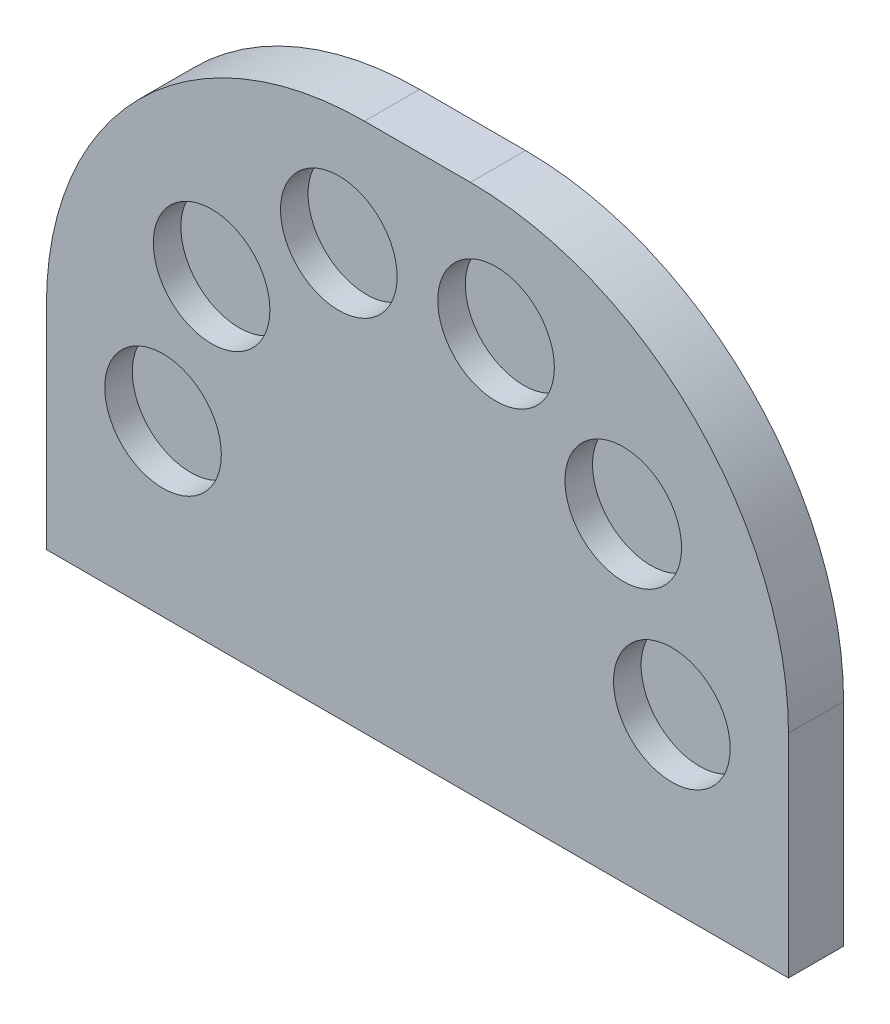
ISO-10303-21;
HEADER;
FILE_DESCRIPTION(('STEP AP214'),'2;1');
FILE_NAME('part.step','',(''),(''),'','','');
FILE_SCHEMA(('AUTOMOTIVE_DESIGN { 1 0 10303 214 1 1 1 1 }'));
ENDSEC;
DATA;
#1=APPLICATION_CONTEXT('core data for automotive mechanical design processes');
#2=APPLICATION_PROTOCOL_DEFINITION('international standard','automotive_design',2000,#1);
#3=PRODUCT_CONTEXT('',#1,'mechanical');
#4=PRODUCT('Part','Part','',(#3));
#5=PRODUCT_RELATED_PRODUCT_CATEGORY('part','',(#4));
#6=PRODUCT_DEFINITION_FORMATION('','',#4);
#7=PRODUCT_DEFINITION_CONTEXT('part definition',#1,'design');
#8=PRODUCT_DEFINITION('design','',#6,#7);
#9=PRODUCT_DEFINITION_SHAPE('','',#8);
#10=(LENGTH_UNIT() NAMED_UNIT(*) SI_UNIT(.MILLI.,.METRE.));
#11=(NAMED_UNIT(*) PLANE_ANGLE_UNIT() SI_UNIT($,.RADIAN.));
#12=(NAMED_UNIT(*) SI_UNIT($,.STERADIAN.) SOLID_ANGLE_UNIT());
#13=UNCERTAINTY_MEASURE_WITH_UNIT(LENGTH_MEASURE(1.E-05),#10,'distance_accuracy_value','');
#14=(GEOMETRIC_REPRESENTATION_CONTEXT(3) GLOBAL_UNCERTAINTY_ASSIGNED_CONTEXT((#13)) GLOBAL_UNIT_ASSIGNED_CONTEXT((#10,
#11,#12)) REPRESENTATION_CONTEXT('',''));
#15=CARTESIAN_POINT('',(0.,0.,0.));
#16=DIRECTION('',(0.,0.,1.));
#17=DIRECTION('',(1.,0.,0.));
#18=AXIS2_PLACEMENT_3D('',#15,#16,#17);
#19=CARTESIAN_POINT('',(0.,0.,0.));
#20=DIRECTION('',(0.,0.,1.));
#21=DIRECTION('',(1.,0.,0.));
#22=AXIS2_PLACEMENT_3D('',#19,#20,#21);
#23=PLANE('',#22);
#24=DIRECTION('',(0.,-1.,0.));
#25=VECTOR('',#24,1.);
#26=CARTESIAN_POINT('',(0.,250.,0.));
#27=LINE('',#26,#25);
#28=CARTESIAN_POINT('',(0.,100.,0.));
#29=VERTEX_POINT('',#28);
#30=CARTESIAN_POINT('',(0.,0.,0.));
#31=VERTEX_POINT('',#30);
#32=EDGE_CURVE('E156',#29,#31,#27,.T.);
#33=ORIENTED_EDGE('',*,*,#32,.F.);
#34=CARTESIAN_POINT('',(150.,100.,0.));
#35=DIRECTION('',(0.,0.,1.));
#36=DIRECTION('',(1.,0.,0.));
#37=AXIS2_PLACEMENT_3D('',#34,#35,#36);
#38=CIRCLE('',#37,150.);
#39=CARTESIAN_POINT('',(150.,250.,0.));
#40=VERTEX_POINT('',#39);
#41=EDGE_CURVE('E41',#29,#40,#38,.F.);
#42=ORIENTED_EDGE('',*,*,#41,.T.);
#43=DIRECTION('',(-1.,0.,0.));
#44=VECTOR('',#43,1.);
#45=CARTESIAN_POINT('',(350.,250.,0.));
#46=LINE('',#45,#44);
#47=CARTESIAN_POINT('',(200.,250.,0.));
#48=VERTEX_POINT('',#47);
#49=EDGE_CURVE('E153',#48,#40,#46,.T.);
#50=ORIENTED_EDGE('',*,*,#49,.F.);
#51=CARTESIAN_POINT('',(200.,100.,0.));
#52=DIRECTION('',(0.,0.,1.));
#53=DIRECTION('',(1.,0.,0.));
#54=AXIS2_PLACEMENT_3D('',#51,#52,#53);
#55=CIRCLE('',#54,150.);
#56=CARTESIAN_POINT('',(350.,100.,0.));
#57=VERTEX_POINT('',#56);
#58=EDGE_CURVE('E48',#48,#57,#55,.F.);
#59=ORIENTED_EDGE('',*,*,#58,.T.);
#60=DIRECTION('',(0.,1.,0.));
#61=VECTOR('',#60,1.);
#62=CARTESIAN_POINT('',(350.,0.,0.));
#63=LINE('',#62,#61);
#64=CARTESIAN_POINT('',(350.,0.,0.));
#65=VERTEX_POINT('',#64);
#66=EDGE_CURVE('E150',#65,#57,#63,.T.);
#67=ORIENTED_EDGE('',*,*,#66,.F.);
#68=DIRECTION('',(1.,0.,0.));
#69=VECTOR('',#68,1.);
#70=CARTESIAN_POINT('',(0.,0.,0.));
#71=LINE('',#70,#69);
#72=EDGE_CURVE('E147',#31,#65,#71,.T.);
#73=ORIENTED_EDGE('',*,*,#72,.F.);
#74=EDGE_LOOP('',(#33,#42,#50,#59,#67,#73));
#75=FACE_BOUND('',#74,.T.);
#76=DIRECTION('',(-1.,0.,0.));
#77=VECTOR('',#76,1.);
#78=CARTESIAN_POINT('',(279.,10.,0.));
#79=LINE('',#78,#77);
#80=CARTESIAN_POINT('',(280.,10.,0.));
#81=VERTEX_POINT('',#80);
#82=CARTESIAN_POINT('',(279.,10.,0.));
#83=VERTEX_POINT('',#82);
#84=EDGE_CURVE('E137',#81,#83,#79,.T.);
#85=ORIENTED_EDGE('',*,*,#84,.F.);
#86=DIRECTION('',(0.,-1.,0.));
#87=VECTOR('',#86,1.);
#88=CARTESIAN_POINT('',(280.,10.,0.));
#89=LINE('',#88,#87);
#90=CARTESIAN_POINT('',(280.,50.,0.));
#91=VERTEX_POINT('',#90);
#92=EDGE_CURVE('E134',#91,#81,#89,.T.);
#93=ORIENTED_EDGE('',*,*,#92,.F.);
#94=DIRECTION('',(1.,0.,0.));
#95=VECTOR('',#94,1.);
#96=CARTESIAN_POINT('',(280.,50.,0.));
#97=LINE('',#96,#95);
#98=CARTESIAN_POINT('',(279.,50.,0.));
#99=VERTEX_POINT('',#98);
#100=EDGE_CURVE('E474',#99,#91,#97,.T.);
#101=ORIENTED_EDGE('',*,*,#100,.F.);
#102=DIRECTION('',(0.,1.,0.));
#103=VECTOR('',#102,1.);
#104=CARTESIAN_POINT('',(279.,50.,0.));
#105=LINE('',#104,#103);
#106=EDGE_CURVE('E472',#83,#99,#105,.T.);
#107=ORIENTED_EDGE('',*,*,#106,.F.);
#108=EDGE_LOOP('',(#85,#93,#101,#107));
#109=FACE_BOUND('',#108,.T.);
#110=ADVANCED_FACE('F33',(#75,#109),#23,.F.);
#111=CARTESIAN_POINT('',(0.,0.,0.));
#112=DIRECTION('',(0.,-1.,0.));
#113=DIRECTION('',(0.,0.,-1.));
#114=AXIS2_PLACEMENT_3D('',#111,#112,#113);
#115=PLANE('',#114);
#116=DIRECTION('',(1.,0.,0.));
#117=VECTOR('',#116,1.);
#118=CARTESIAN_POINT('',(0.,0.,26.));
#119=LINE('',#118,#117);
#120=CARTESIAN_POINT('',(0.,0.,26.));
#121=VERTEX_POINT('',#120);
#122=CARTESIAN_POINT('',(350.,0.,26.));
#123=VERTEX_POINT('',#122);
#124=EDGE_CURVE('E138',#121,#123,#119,.T.);
#125=ORIENTED_EDGE('',*,*,#124,.F.);
#126=DIRECTION('',(0.,0.,1.));
#127=VECTOR('',#126,1.);
#128=CARTESIAN_POINT('',(0.,0.,0.));
#129=LINE('',#128,#127);
#130=EDGE_CURVE('E165',#31,#121,#129,.T.);
#131=ORIENTED_EDGE('',*,*,#130,.F.);
#132=ORIENTED_EDGE('',*,*,#72,.T.);
#133=DIRECTION('',(0.,0.,1.));
#134=VECTOR('',#133,1.);
#135=CARTESIAN_POINT('',(350.,0.,0.));
#136=LINE('',#135,#134);
#137=EDGE_CURVE('E157',#65,#123,#136,.T.);
#138=ORIENTED_EDGE('',*,*,#137,.T.);
#139=EDGE_LOOP('',(#125,#131,#132,#138));
#140=FACE_BOUND('',#139,.T.);
#141=ADVANCED_FACE('F195',(#140),#115,.T.);
#142=CARTESIAN_POINT('',(0.,250.,0.));
#143=DIRECTION('',(-1.,0.,0.));
#144=DIRECTION('',(0.,0.,1.));
#145=AXIS2_PLACEMENT_3D('',#142,#143,#144);
#146=PLANE('',#145);
#147=DIRECTION('',(0.,-1.,0.));
#148=VECTOR('',#147,1.);
#149=CARTESIAN_POINT('',(0.,250.,26.));
#150=LINE('',#149,#148);
#151=CARTESIAN_POINT('',(0.,100.,26.));
#152=VERTEX_POINT('',#151);
#153=EDGE_CURVE('E151',#152,#121,#150,.T.);
#154=ORIENTED_EDGE('',*,*,#153,.F.);
#155=DIRECTION('',(0.,0.,1.));
#156=VECTOR('',#155,1.);
#157=CARTESIAN_POINT('',(0.,100.,0.));
#158=LINE('',#157,#156);
#159=EDGE_CURVE('E56',#152,#29,#158,.F.);
#160=ORIENTED_EDGE('',*,*,#159,.T.);
#161=ORIENTED_EDGE('',*,*,#32,.T.);
#162=ORIENTED_EDGE('',*,*,#130,.T.);
#163=EDGE_LOOP('',(#154,#160,#161,#162));
#164=FACE_BOUND('',#163,.T.);
#165=ADVANCED_FACE('F191',(#164),#146,.T.);
#166=CARTESIAN_POINT('',(350.,250.,0.));
#167=DIRECTION('',(0.,1.,0.));
#168=DIRECTION('',(0.,0.,1.));
#169=AXIS2_PLACEMENT_3D('',#166,#167,#168);
#170=PLANE('',#169);
#171=ORIENTED_EDGE('',*,*,#49,.T.);
#172=DIRECTION('',(0.,0.,1.));
#173=VECTOR('',#172,1.);
#174=CARTESIAN_POINT('',(150.,250.,0.));
#175=LINE('',#174,#173);
#176=CARTESIAN_POINT('',(150.,250.,26.));
#177=VERTEX_POINT('',#176);
#178=EDGE_CURVE('E171',#40,#177,#175,.T.);
#179=ORIENTED_EDGE('',*,*,#178,.T.);
#180=DIRECTION('',(-1.,0.,0.));
#181=VECTOR('',#180,1.);
#182=CARTESIAN_POINT('',(350.,250.,26.));
#183=LINE('',#182,#181);
#184=CARTESIAN_POINT('',(200.,250.,26.));
#185=VERTEX_POINT('',#184);
#186=EDGE_CURVE('E161',#185,#177,#183,.T.);
#187=ORIENTED_EDGE('',*,*,#186,.F.);
#188=DIRECTION('',(0.,0.,1.));
#189=VECTOR('',#188,1.);
#190=CARTESIAN_POINT('',(200.,250.,0.));
#191=LINE('',#190,#189);
#192=EDGE_CURVE('E168',#185,#48,#191,.F.);
#193=ORIENTED_EDGE('',*,*,#192,.T.);
#194=EDGE_LOOP('',(#171,#179,#187,#193));
#195=FACE_BOUND('',#194,.T.);
#196=ADVANCED_FACE('F185',(#195),#170,.T.);
#197=CARTESIAN_POINT('',(350.,0.,0.));
#198=DIRECTION('',(1.,0.,0.));
#199=DIRECTION('',(0.,0.,-1.));
#200=AXIS2_PLACEMENT_3D('',#197,#198,#199);
#201=PLANE('',#200);
#202=ORIENTED_EDGE('',*,*,#66,.T.);
#203=DIRECTION('',(0.,0.,1.));
#204=VECTOR('',#203,1.);
#205=CARTESIAN_POINT('',(350.,100.,0.));
#206=LINE('',#205,#204);
#207=CARTESIAN_POINT('',(350.,100.,26.));
#208=VERTEX_POINT('',#207);
#209=EDGE_CURVE('E11',#57,#208,#206,.T.);
#210=ORIENTED_EDGE('',*,*,#209,.T.);
#211=DIRECTION('',(0.,1.,0.));
#212=VECTOR('',#211,1.);
#213=CARTESIAN_POINT('',(350.,0.,26.));
#214=LINE('',#213,#212);
#215=EDGE_CURVE('E141',#123,#208,#214,.T.);
#216=ORIENTED_EDGE('',*,*,#215,.F.);
#217=ORIENTED_EDGE('',*,*,#137,.F.);
#218=EDGE_LOOP('',(#202,#210,#216,#217));
#219=FACE_BOUND('',#218,.T.);
#220=ADVANCED_FACE('F198',(#219),#201,.T.);
#221=CARTESIAN_POINT('',(0.,0.,26.));
#222=DIRECTION('',(0.,0.,1.));
#223=DIRECTION('',(1.,0.,0.));
#224=AXIS2_PLACEMENT_3D('',#221,#222,#223);
#225=PLANE('',#224);
#226=CARTESIAN_POINT('',(55.,80.,26.));
#227=DIRECTION('',(0.,0.,1.));
#228=DIRECTION('',(1.,0.,0.));
#229=AXIS2_PLACEMENT_3D('',#226,#227,#228);
#230=CIRCLE('',#229,27.5);
#231=CARTESIAN_POINT('',(82.5,80.,26.));
#232=VERTEX_POINT('',#231);
#233=EDGE_CURVE('E434',#232,#232,#230,.T.);
#234=ORIENTED_EDGE('',*,*,#233,.F.);
#235=EDGE_LOOP('',(#234));
#236=FACE_BOUND('',#235,.T.);
#237=CARTESIAN_POINT('',(212.082039324994,194.126781955418,26.));
#238=DIRECTION('',(0.,0.,1.));
#239=DIRECTION('',(1.,0.,0.));
#240=AXIS2_PLACEMENT_3D('',#237,#238,#239);
#241=CIRCLE('',#240,27.5);
#242=CARTESIAN_POINT('',(239.582039324994,194.126781955418,26.));
#243=VERTEX_POINT('',#242);
#244=EDGE_CURVE('E436',#243,#243,#241,.T.);
#245=ORIENTED_EDGE('',*,*,#244,.F.);
#246=EDGE_LOOP('',(#245));
#247=FACE_BOUND('',#246,.T.);
#248=CARTESIAN_POINT('',(272.082039324994,150.534230275097,26.));
#249=DIRECTION('',(0.,0.,1.));
#250=DIRECTION('',(1.,0.,0.));
#251=AXIS2_PLACEMENT_3D('',#248,#249,#250);
#252=CIRCLE('',#251,27.5);
#253=CARTESIAN_POINT('',(299.582039324993,150.534230275097,26.));
#254=VERTEX_POINT('',#253);
#255=EDGE_CURVE('E444',#254,#254,#252,.T.);
#256=ORIENTED_EDGE('',*,*,#255,.F.);
#257=EDGE_LOOP('',(#256));
#258=FACE_BOUND('',#257,.T.);
#259=CARTESIAN_POINT('',(295.,80.,26.));
#260=DIRECTION('',(0.,0.,1.));
#261=DIRECTION('',(1.,0.,0.));
#262=AXIS2_PLACEMENT_3D('',#259,#260,#261);
#263=CIRCLE('',#262,27.5);
#264=CARTESIAN_POINT('',(322.5,80.,26.));
#265=VERTEX_POINT('',#264);
#266=EDGE_CURVE('E450',#265,#265,#263,.T.);
#267=ORIENTED_EDGE('',*,*,#266,.F.);
#268=EDGE_LOOP('',(#267));
#269=FACE_BOUND('',#268,.T.);
#270=CARTESIAN_POINT('',(137.917960675006,194.126781955418,26.));
#271=DIRECTION('',(0.,0.,1.));
#272=DIRECTION('',(1.,0.,0.));
#273=AXIS2_PLACEMENT_3D('',#270,#271,#272);
#274=CIRCLE('',#273,27.5);
#275=CARTESIAN_POINT('',(165.417960675006,194.126781955418,26.));
#276=VERTEX_POINT('',#275);
#277=EDGE_CURVE('E456',#276,#276,#274,.T.);
#278=ORIENTED_EDGE('',*,*,#277,.F.);
#279=EDGE_LOOP('',(#278));
#280=FACE_BOUND('',#279,.T.);
#281=CARTESIAN_POINT('',(77.9179606750063,150.534230275097,26.));
#282=DIRECTION('',(0.,0.,1.));
#283=DIRECTION('',(1.,0.,0.));
#284=AXIS2_PLACEMENT_3D('',#281,#282,#283);
#285=CIRCLE('',#284,27.5);
#286=CARTESIAN_POINT('',(105.417960675006,150.534230275097,26.));
#287=VERTEX_POINT('',#286);
#288=EDGE_CURVE('E462',#287,#287,#285,.T.);
#289=ORIENTED_EDGE('',*,*,#288,.F.);
#290=EDGE_LOOP('',(#289));
#291=FACE_BOUND('',#290,.T.);
#292=ORIENTED_EDGE('',*,*,#186,.T.);
#293=CARTESIAN_POINT('',(150.,100.,26.));
#294=DIRECTION('',(0.,0.,1.));
#295=DIRECTION('',(1.,0.,0.));
#296=AXIS2_PLACEMENT_3D('',#293,#294,#295);
#297=CIRCLE('',#296,150.);
#298=EDGE_CURVE('E176',#177,#152,#297,.T.);
#299=ORIENTED_EDGE('',*,*,#298,.T.);
#300=ORIENTED_EDGE('',*,*,#153,.T.);
#301=ORIENTED_EDGE('',*,*,#124,.T.);
#302=ORIENTED_EDGE('',*,*,#215,.T.);
#303=CARTESIAN_POINT('',(200.,100.,26.));
#304=DIRECTION('',(0.,0.,1.));
#305=DIRECTION('',(1.,0.,0.));
#306=AXIS2_PLACEMENT_3D('',#303,#304,#305);
#307=CIRCLE('',#306,150.);
#308=EDGE_CURVE('E174',#208,#185,#307,.T.);
#309=ORIENTED_EDGE('',*,*,#308,.T.);
#310=EDGE_LOOP('',(#292,#299,#300,#301,#302,#309));
#311=FACE_BOUND('',#310,.T.);
#312=ADVANCED_FACE('F190',(#236,#247,#258,#269,#280,#291,#311),#225,.T.);
#313=CARTESIAN_POINT('',(279.,10.,-50.));
#314=DIRECTION('',(0.,1.,0.));
#315=DIRECTION('',(0.,0.,1.));
#316=AXIS2_PLACEMENT_3D('',#313,#314,#315);
#317=PLANE('',#316);
#318=ORIENTED_EDGE('',*,*,#84,.T.);
#319=DIRECTION('',(0.,0.,1.));
#320=VECTOR('',#319,1.);
#321=CARTESIAN_POINT('',(279.,10.,-50.));
#322=LINE('',#321,#320);
#323=CARTESIAN_POINT('',(279.,10.,-50.));
#324=VERTEX_POINT('',#323);
#325=EDGE_CURVE('E118',#324,#83,#322,.T.);
#326=ORIENTED_EDGE('',*,*,#325,.F.);
#327=DIRECTION('',(-1.,0.,0.));
#328=VECTOR('',#327,1.);
#329=CARTESIAN_POINT('',(279.,10.,-50.));
#330=LINE('',#329,#328);
#331=CARTESIAN_POINT('',(280.,10.,-50.));
#332=VERTEX_POINT('',#331);
#333=EDGE_CURVE('E125',#332,#324,#330,.T.);
#334=ORIENTED_EDGE('',*,*,#333,.F.);
#335=DIRECTION('',(0.,0.,1.));
#336=VECTOR('',#335,1.);
#337=CARTESIAN_POINT('',(280.,10.,-50.));
#338=LINE('',#337,#336);
#339=EDGE_CURVE('E470',#332,#81,#338,.T.);
#340=ORIENTED_EDGE('',*,*,#339,.T.);
#341=EDGE_LOOP('',(#318,#326,#334,#340));
#342=FACE_BOUND('',#341,.T.);
#343=ADVANCED_FACE('F136',(#342),#317,.F.);
#344=CARTESIAN_POINT('',(279.,50.,-50.));
#345=DIRECTION('',(1.,0.,0.));
#346=DIRECTION('',(0.,0.,-1.));
#347=AXIS2_PLACEMENT_3D('',#344,#345,#346);
#348=PLANE('',#347);
#349=ORIENTED_EDGE('',*,*,#106,.T.);
#350=DIRECTION('',(0.,0.,1.));
#351=VECTOR('',#350,1.);
#352=CARTESIAN_POINT('',(279.,50.,-50.));
#353=LINE('',#352,#351);
#354=CARTESIAN_POINT('',(279.,50.,-50.));
#355=VERTEX_POINT('',#354);
#356=EDGE_CURVE('E121',#355,#99,#353,.T.);
#357=ORIENTED_EDGE('',*,*,#356,.F.);
#358=DIRECTION('',(0.,1.,0.));
#359=VECTOR('',#358,1.);
#360=CARTESIAN_POINT('',(279.,50.,-50.));
#361=LINE('',#360,#359);
#362=EDGE_CURVE('E113',#324,#355,#361,.T.);
#363=ORIENTED_EDGE('',*,*,#362,.F.);
#364=ORIENTED_EDGE('',*,*,#325,.T.);
#365=EDGE_LOOP('',(#349,#357,#363,#364));
#366=FACE_BOUND('',#365,.T.);
#367=ADVANCED_FACE('F116',(#366),#348,.F.);
#368=CARTESIAN_POINT('',(280.,50.,-50.));
#369=DIRECTION('',(0.,-1.,0.));
#370=DIRECTION('',(0.,0.,-1.));
#371=AXIS2_PLACEMENT_3D('',#368,#369,#370);
#372=PLANE('',#371);
#373=ORIENTED_EDGE('',*,*,#100,.T.);
#374=DIRECTION('',(0.,0.,1.));
#375=VECTOR('',#374,1.);
#376=CARTESIAN_POINT('',(280.,50.,-50.));
#377=LINE('',#376,#375);
#378=CARTESIAN_POINT('',(280.,50.,-50.));
#379=VERTEX_POINT('',#378);
#380=EDGE_CURVE('E143',#379,#91,#377,.T.);
#381=ORIENTED_EDGE('',*,*,#380,.F.);
#382=DIRECTION('',(1.,0.,0.));
#383=VECTOR('',#382,1.);
#384=CARTESIAN_POINT('',(280.,50.,-50.));
#385=LINE('',#384,#383);
#386=EDGE_CURVE('E124',#355,#379,#385,.T.);
#387=ORIENTED_EDGE('',*,*,#386,.F.);
#388=ORIENTED_EDGE('',*,*,#356,.T.);
#389=EDGE_LOOP('',(#373,#381,#387,#388));
#390=FACE_BOUND('',#389,.T.);
#391=ADVANCED_FACE('F244',(#390),#372,.F.);
#392=CARTESIAN_POINT('',(280.,10.,-50.));
#393=DIRECTION('',(-1.,0.,0.));
#394=DIRECTION('',(0.,0.,1.));
#395=AXIS2_PLACEMENT_3D('',#392,#393,#394);
#396=PLANE('',#395);
#397=ORIENTED_EDGE('',*,*,#92,.T.);
#398=ORIENTED_EDGE('',*,*,#339,.F.);
#399=DIRECTION('',(0.,-1.,0.));
#400=VECTOR('',#399,1.);
#401=CARTESIAN_POINT('',(280.,10.,-50.));
#402=LINE('',#401,#400);
#403=EDGE_CURVE('E130',#379,#332,#402,.T.);
#404=ORIENTED_EDGE('',*,*,#403,.F.);
#405=ORIENTED_EDGE('',*,*,#380,.T.);
#406=EDGE_LOOP('',(#397,#398,#404,#405));
#407=FACE_BOUND('',#406,.T.);
#408=ADVANCED_FACE('F250',(#407),#396,.F.);
#409=CARTESIAN_POINT('',(0.,0.,-50.));
#410=DIRECTION('',(0.,0.,1.));
#411=DIRECTION('',(1.,0.,0.));
#412=AXIS2_PLACEMENT_3D('',#409,#410,#411);
#413=PLANE('',#412);
#414=ORIENTED_EDGE('',*,*,#333,.T.);
#415=ORIENTED_EDGE('',*,*,#362,.T.);
#416=ORIENTED_EDGE('',*,*,#386,.T.);
#417=ORIENTED_EDGE('',*,*,#403,.T.);
#418=EDGE_LOOP('',(#414,#415,#416,#417));
#419=FACE_BOUND('',#418,.T.);
#420=ADVANCED_FACE('F128',(#419),#413,.F.);
#421=CARTESIAN_POINT('',(77.9179606750063,150.534230275097,13.));
#422=DIRECTION('',(0.,0.,-1.));
#423=DIRECTION('',(-1.,0.,0.));
#424=AXIS2_PLACEMENT_3D('',#421,#422,#423);
#425=PLANE('',#424);
#426=CARTESIAN_POINT('',(77.9179606750063,150.534230275097,13.));
#427=DIRECTION('',(0.,0.,1.));
#428=DIRECTION('',(1.,0.,0.));
#429=AXIS2_PLACEMENT_3D('',#426,#427,#428);
#430=CIRCLE('',#429,27.5);
#431=CARTESIAN_POINT('',(105.417960675006,150.534230275097,13.));
#432=VERTEX_POINT('',#431);
#433=EDGE_CURVE('E465',#432,#432,#430,.T.);
#434=ORIENTED_EDGE('',*,*,#433,.T.);
#435=EDGE_LOOP('',(#434));
#436=FACE_BOUND('',#435,.T.);
#437=ADVANCED_FACE('F265',(#436),#425,.F.);
#438=CARTESIAN_POINT('',(77.9179606750063,150.534230275097,26.));
#439=DIRECTION('',(0.,0.,1.));
#440=DIRECTION('',(1.,0.,0.));
#441=AXIS2_PLACEMENT_3D('',#438,#439,#440);
#442=CYLINDRICAL_SURFACE('',#441,27.5);
#443=ORIENTED_EDGE('',*,*,#433,.F.);
#444=EDGE_LOOP('',(#443));
#445=FACE_BOUND('',#444,.T.);
#446=ORIENTED_EDGE('',*,*,#288,.T.);
#447=EDGE_LOOP('',(#446));
#448=FACE_BOUND('',#447,.T.);
#449=ADVANCED_FACE('F272',(#445,#448),#442,.F.);
#450=CARTESIAN_POINT('',(137.917960675006,194.126781955418,13.));
#451=DIRECTION('',(0.,0.,-1.));
#452=DIRECTION('',(-1.,0.,0.));
#453=AXIS2_PLACEMENT_3D('',#450,#451,#452);
#454=PLANE('',#453);
#455=CARTESIAN_POINT('',(137.917960675006,194.126781955418,13.));
#456=DIRECTION('',(0.,0.,1.));
#457=DIRECTION('',(1.,0.,0.));
#458=AXIS2_PLACEMENT_3D('',#455,#456,#457);
#459=CIRCLE('',#458,27.5);
#460=CARTESIAN_POINT('',(165.417960675006,194.126781955418,13.));
#461=VERTEX_POINT('',#460);
#462=EDGE_CURVE('E459',#461,#461,#459,.T.);
#463=ORIENTED_EDGE('',*,*,#462,.T.);
#464=EDGE_LOOP('',(#463));
#465=FACE_BOUND('',#464,.T.);
#466=ADVANCED_FACE('F280',(#465),#454,.F.);
#467=CARTESIAN_POINT('',(137.917960675006,194.126781955418,26.));
#468=DIRECTION('',(0.,0.,1.));
#469=DIRECTION('',(1.,0.,0.));
#470=AXIS2_PLACEMENT_3D('',#467,#468,#469);
#471=CYLINDRICAL_SURFACE('',#470,27.5);
#472=ORIENTED_EDGE('',*,*,#462,.F.);
#473=EDGE_LOOP('',(#472));
#474=FACE_BOUND('',#473,.T.);
#475=ORIENTED_EDGE('',*,*,#277,.T.);
#476=EDGE_LOOP('',(#475));
#477=FACE_BOUND('',#476,.T.);
#478=ADVANCED_FACE('F288',(#474,#477),#471,.F.);
#479=CARTESIAN_POINT('',(295.,80.,13.));
#480=DIRECTION('',(0.,0.,-1.));
#481=DIRECTION('',(-1.,0.,0.));
#482=AXIS2_PLACEMENT_3D('',#479,#480,#481);
#483=PLANE('',#482);
#484=CARTESIAN_POINT('',(295.,80.,13.));
#485=DIRECTION('',(0.,0.,1.));
#486=DIRECTION('',(1.,0.,0.));
#487=AXIS2_PLACEMENT_3D('',#484,#485,#486);
#488=CIRCLE('',#487,27.5);
#489=CARTESIAN_POINT('',(322.5,80.,13.));
#490=VERTEX_POINT('',#489);
#491=EDGE_CURVE('E453',#490,#490,#488,.T.);
#492=ORIENTED_EDGE('',*,*,#491,.T.);
#493=EDGE_LOOP('',(#492));
#494=FACE_BOUND('',#493,.T.);
#495=ADVANCED_FACE('F296',(#494),#483,.F.);
#496=CARTESIAN_POINT('',(295.,80.,26.));
#497=DIRECTION('',(0.,0.,1.));
#498=DIRECTION('',(1.,0.,0.));
#499=AXIS2_PLACEMENT_3D('',#496,#497,#498);
#500=CYLINDRICAL_SURFACE('',#499,27.5);
#501=ORIENTED_EDGE('',*,*,#491,.F.);
#502=EDGE_LOOP('',(#501));
#503=FACE_BOUND('',#502,.T.);
#504=ORIENTED_EDGE('',*,*,#266,.T.);
#505=EDGE_LOOP('',(#504));
#506=FACE_BOUND('',#505,.T.);
#507=ADVANCED_FACE('F304',(#503,#506),#500,.F.);
#508=CARTESIAN_POINT('',(272.082039324994,150.534230275097,13.));
#509=DIRECTION('',(0.,0.,-1.));
#510=DIRECTION('',(-1.,0.,0.));
#511=AXIS2_PLACEMENT_3D('',#508,#509,#510);
#512=PLANE('',#511);
#513=CARTESIAN_POINT('',(272.082039324994,150.534230275097,13.));
#514=DIRECTION('',(0.,0.,1.));
#515=DIRECTION('',(1.,0.,0.));
#516=AXIS2_PLACEMENT_3D('',#513,#514,#515);
#517=CIRCLE('',#516,27.5);
#518=CARTESIAN_POINT('',(299.582039324993,150.534230275097,13.));
#519=VERTEX_POINT('',#518);
#520=EDGE_CURVE('E447',#519,#519,#517,.T.);
#521=ORIENTED_EDGE('',*,*,#520,.T.);
#522=EDGE_LOOP('',(#521));
#523=FACE_BOUND('',#522,.T.);
#524=ADVANCED_FACE('F312',(#523),#512,.F.);
#525=CARTESIAN_POINT('',(272.082039324994,150.534230275097,26.));
#526=DIRECTION('',(0.,0.,1.));
#527=DIRECTION('',(1.,0.,0.));
#528=AXIS2_PLACEMENT_3D('',#525,#526,#527);
#529=CYLINDRICAL_SURFACE('',#528,27.5);
#530=ORIENTED_EDGE('',*,*,#520,.F.);
#531=EDGE_LOOP('',(#530));
#532=FACE_BOUND('',#531,.T.);
#533=ORIENTED_EDGE('',*,*,#255,.T.);
#534=EDGE_LOOP('',(#533));
#535=FACE_BOUND('',#534,.T.);
#536=ADVANCED_FACE('F320',(#532,#535),#529,.F.);
#537=CARTESIAN_POINT('',(212.082039324994,194.126781955418,13.));
#538=DIRECTION('',(0.,0.,-1.));
#539=DIRECTION('',(-1.,0.,0.));
#540=AXIS2_PLACEMENT_3D('',#537,#538,#539);
#541=PLANE('',#540);
#542=CARTESIAN_POINT('',(212.082039324994,194.126781955418,13.));
#543=DIRECTION('',(0.,0.,1.));
#544=DIRECTION('',(1.,0.,0.));
#545=AXIS2_PLACEMENT_3D('',#542,#543,#544);
#546=CIRCLE('',#545,27.5);
#547=CARTESIAN_POINT('',(239.582039324994,194.126781955418,13.));
#548=VERTEX_POINT('',#547);
#549=EDGE_CURVE('E441',#548,#548,#546,.T.);
#550=ORIENTED_EDGE('',*,*,#549,.T.);
#551=EDGE_LOOP('',(#550));
#552=FACE_BOUND('',#551,.T.);
#553=ADVANCED_FACE('F328',(#552),#541,.F.);
#554=CARTESIAN_POINT('',(212.082039324994,194.126781955418,26.));
#555=DIRECTION('',(0.,0.,1.));
#556=DIRECTION('',(1.,0.,0.));
#557=AXIS2_PLACEMENT_3D('',#554,#555,#556);
#558=CYLINDRICAL_SURFACE('',#557,27.5);
#559=ORIENTED_EDGE('',*,*,#549,.F.);
#560=EDGE_LOOP('',(#559));
#561=FACE_BOUND('',#560,.T.);
#562=ORIENTED_EDGE('',*,*,#244,.T.);
#563=EDGE_LOOP('',(#562));
#564=FACE_BOUND('',#563,.T.);
#565=ADVANCED_FACE('F336',(#561,#564),#558,.F.);
#566=CARTESIAN_POINT('',(55.,80.,13.));
#567=DIRECTION('',(0.,0.,-1.));
#568=DIRECTION('',(-1.,0.,0.));
#569=AXIS2_PLACEMENT_3D('',#566,#567,#568);
#570=PLANE('',#569);
#571=CARTESIAN_POINT('',(55.,80.,13.));
#572=DIRECTION('',(0.,0.,1.));
#573=DIRECTION('',(1.,0.,0.));
#574=AXIS2_PLACEMENT_3D('',#571,#572,#573);
#575=CIRCLE('',#574,27.5);
#576=CARTESIAN_POINT('',(82.5,80.,13.));
#577=VERTEX_POINT('',#576);
#578=EDGE_CURVE('E431',#577,#577,#575,.T.);
#579=ORIENTED_EDGE('',*,*,#578,.T.);
#580=EDGE_LOOP('',(#579));
#581=FACE_BOUND('',#580,.T.);
#582=ADVANCED_FACE('F344',(#581),#570,.F.);
#583=CARTESIAN_POINT('',(55.,80.,26.));
#584=DIRECTION('',(0.,0.,1.));
#585=DIRECTION('',(1.,0.,0.));
#586=AXIS2_PLACEMENT_3D('',#583,#584,#585);
#587=CYLINDRICAL_SURFACE('',#586,27.5);
#588=ORIENTED_EDGE('',*,*,#578,.F.);
#589=EDGE_LOOP('',(#588));
#590=FACE_BOUND('',#589,.T.);
#591=ORIENTED_EDGE('',*,*,#233,.T.);
#592=EDGE_LOOP('',(#591));
#593=FACE_BOUND('',#592,.T.);
#594=ADVANCED_FACE('F205',(#590,#593),#587,.F.);
#595=CARTESIAN_POINT('',(150.,100.,0.));
#596=DIRECTION('',(0.,0.,1.));
#597=DIRECTION('',(1.,0.,0.));
#598=AXIS2_PLACEMENT_3D('',#595,#596,#597);
#599=CYLINDRICAL_SURFACE('',#598,150.);
#600=ORIENTED_EDGE('',*,*,#41,.F.);
#601=ORIENTED_EDGE('',*,*,#159,.F.);
#602=ORIENTED_EDGE('',*,*,#298,.F.);
#603=ORIENTED_EDGE('',*,*,#178,.F.);
#604=EDGE_LOOP('',(#600,#601,#602,#603));
#605=FACE_BOUND('',#604,.T.);
#606=ADVANCED_FACE('F188',(#605),#599,.T.);
#607=CARTESIAN_POINT('',(200.,100.,0.));
#608=DIRECTION('',(0.,0.,1.));
#609=DIRECTION('',(1.,0.,0.));
#610=AXIS2_PLACEMENT_3D('',#607,#608,#609);
#611=CYLINDRICAL_SURFACE('',#610,150.);
#612=ORIENTED_EDGE('',*,*,#58,.F.);
#613=ORIENTED_EDGE('',*,*,#192,.F.);
#614=ORIENTED_EDGE('',*,*,#308,.F.);
#615=ORIENTED_EDGE('',*,*,#209,.F.);
#616=EDGE_LOOP('',(#612,#613,#614,#615));
#617=FACE_BOUND('',#616,.T.);
#618=ADVANCED_FACE('F35',(#617),#611,.T.);
#619=CLOSED_SHELL('',(#110,#141,#165,#196,#220,#312,#343,#367,#391,#408,#420,#437,#449,#466,
#478,#495,#507,#524,#536,#553,#565,#582,#594,#606,#618));
#620=MANIFOLD_SOLID_BREP('B2',#619);
#621=ADVANCED_BREP_SHAPE_REPRESENTATION('',(#18,#620),#14);
#622=SHAPE_DEFINITION_REPRESENTATION(#9,#621);
ENDSEC;
END-ISO-10303-21;
